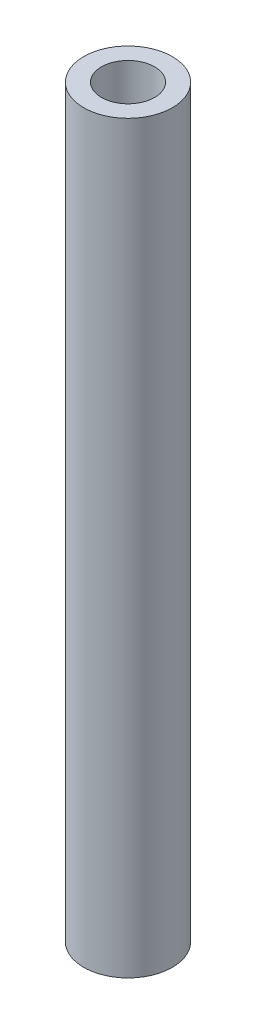
ISO-10303-21;
HEADER;
FILE_DESCRIPTION(('STEP AP214'),'2;1');
FILE_NAME('part.step','',(''),(''),'','','');
FILE_SCHEMA(('AUTOMOTIVE_DESIGN { 1 0 10303 214 1 1 1 1 }'));
ENDSEC;
DATA;
#1=APPLICATION_CONTEXT('core data for automotive mechanical design processes');
#2=APPLICATION_PROTOCOL_DEFINITION('international standard','automotive_design',2000,#1);
#3=PRODUCT_CONTEXT('',#1,'mechanical');
#4=PRODUCT('Part','Part','',(#3));
#5=PRODUCT_RELATED_PRODUCT_CATEGORY('part','',(#4));
#6=PRODUCT_DEFINITION_FORMATION('','',#4);
#7=PRODUCT_DEFINITION_CONTEXT('part definition',#1,'design');
#8=PRODUCT_DEFINITION('design','',#6,#7);
#9=PRODUCT_DEFINITION_SHAPE('','',#8);
#10=(LENGTH_UNIT() NAMED_UNIT(*) SI_UNIT(.MILLI.,.METRE.));
#11=(NAMED_UNIT(*) PLANE_ANGLE_UNIT() SI_UNIT($,.RADIAN.));
#12=(NAMED_UNIT(*) SI_UNIT($,.STERADIAN.) SOLID_ANGLE_UNIT());
#13=UNCERTAINTY_MEASURE_WITH_UNIT(LENGTH_MEASURE(1.E-05),#10,'distance_accuracy_value','');
#14=(GEOMETRIC_REPRESENTATION_CONTEXT(3) GLOBAL_UNCERTAINTY_ASSIGNED_CONTEXT((#13)) GLOBAL_UNIT_ASSIGNED_CONTEXT((#10,
#11,#12)) REPRESENTATION_CONTEXT('',''));
#15=CARTESIAN_POINT('',(0.,0.,0.));
#16=DIRECTION('',(0.,0.,1.));
#17=DIRECTION('',(1.,0.,0.));
#18=AXIS2_PLACEMENT_3D('',#15,#16,#17);
#19=CARTESIAN_POINT('',(0.,42.,0.));
#20=DIRECTION('',(0.,1.,0.));
#21=DIRECTION('',(0.,0.,1.));
#22=AXIS2_PLACEMENT_3D('',#19,#20,#21);
#23=PLANE('',#22);
#24=CARTESIAN_POINT('',(0.,42.,0.));
#25=DIRECTION('',(0.,1.,0.));
#26=DIRECTION('',(0.,0.,1.));
#27=AXIS2_PLACEMENT_3D('',#24,#25,#26);
#28=CIRCLE('',#27,2.5);
#29=CARTESIAN_POINT('',(0.,42.,-2.5));
#30=VERTEX_POINT('',#29);
#31=EDGE_CURVE('E10',#30,#30,#28,.T.);
#32=ORIENTED_EDGE('',*,*,#31,.T.);
#33=EDGE_LOOP('',(#32));
#34=FACE_BOUND('',#33,.T.);
#35=CARTESIAN_POINT('',(0.,42.,0.));
#36=DIRECTION('',(0.,1.,0.));
#37=DIRECTION('',(0.,0.,1.));
#38=AXIS2_PLACEMENT_3D('',#35,#36,#37);
#39=CIRCLE('',#38,1.5);
#40=CARTESIAN_POINT('',(0.,42.,-1.5));
#41=VERTEX_POINT('',#40);
#42=EDGE_CURVE('E49',#41,#41,#39,.T.);
#43=ORIENTED_EDGE('',*,*,#42,.F.);
#44=EDGE_LOOP('',(#43));
#45=FACE_BOUND('',#44,.T.);
#46=ADVANCED_FACE('F38',(#34,#45),#23,.T.);
#47=CARTESIAN_POINT('',(0.,0.,0.));
#48=DIRECTION('',(0.,1.,0.));
#49=DIRECTION('',(0.,0.,1.));
#50=AXIS2_PLACEMENT_3D('',#47,#48,#49);
#51=PLANE('',#50);
#52=CARTESIAN_POINT('',(0.,0.,0.));
#53=DIRECTION('',(0.,1.,0.));
#54=DIRECTION('',(0.,0.,1.));
#55=AXIS2_PLACEMENT_3D('',#52,#53,#54);
#56=CIRCLE('',#55,2.5);
#57=CARTESIAN_POINT('',(0.,0.,-2.5));
#58=VERTEX_POINT('',#57);
#59=EDGE_CURVE('E42',#58,#58,#56,.T.);
#60=ORIENTED_EDGE('',*,*,#59,.F.);
#61=EDGE_LOOP('',(#60));
#62=FACE_BOUND('',#61,.T.);
#63=CARTESIAN_POINT('',(0.,0.,0.));
#64=DIRECTION('',(0.,1.,0.));
#65=DIRECTION('',(0.,0.,1.));
#66=AXIS2_PLACEMENT_3D('',#63,#64,#65);
#67=CIRCLE('',#66,1.5);
#68=CARTESIAN_POINT('',(0.,0.,-1.5));
#69=VERTEX_POINT('',#68);
#70=EDGE_CURVE('E51',#69,#69,#67,.T.);
#71=ORIENTED_EDGE('',*,*,#70,.T.);
#72=EDGE_LOOP('',(#71));
#73=FACE_BOUND('',#72,.T.);
#74=ADVANCED_FACE('F61',(#62,#73),#51,.F.);
#75=CARTESIAN_POINT('',(0.,42.,0.));
#76=DIRECTION('',(0.,-1.,0.));
#77=DIRECTION('',(0.,0.,-1.));
#78=AXIS2_PLACEMENT_3D('',#75,#76,#77);
#79=CYLINDRICAL_SURFACE('',#78,2.5);
#80=CARTESIAN_POINT('',(0.,42.,-2.5));
#81=CARTESIAN_POINT('',(0.,41.5625,-2.5));
#82=CARTESIAN_POINT('',(0.,41.125,-2.5));
#83=CARTESIAN_POINT('',(0.,40.25,-2.5));
#84=CARTESIAN_POINT('',(0.,39.8125,-2.5));
#85=CARTESIAN_POINT('',(0.,38.9375,-2.5));
#86=CARTESIAN_POINT('',(0.,38.5,-2.5));
#87=CARTESIAN_POINT('',(0.,37.625,-2.5));
#88=CARTESIAN_POINT('',(0.,37.1875,-2.5));
#89=CARTESIAN_POINT('',(0.,36.3125,-2.5));
#90=CARTESIAN_POINT('',(0.,35.875,-2.5));
#91=CARTESIAN_POINT('',(0.,35.,-2.5));
#92=CARTESIAN_POINT('',(0.,34.5625,-2.5));
#93=CARTESIAN_POINT('',(0.,33.6875,-2.5));
#94=CARTESIAN_POINT('',(0.,33.25,-2.5));
#95=CARTESIAN_POINT('',(0.,32.375,-2.5));
#96=CARTESIAN_POINT('',(0.,31.9375,-2.5));
#97=CARTESIAN_POINT('',(0.,31.0625,-2.5));
#98=CARTESIAN_POINT('',(0.,30.625,-2.5));
#99=CARTESIAN_POINT('',(0.,29.75,-2.5));
#100=CARTESIAN_POINT('',(0.,29.3125,-2.5));
#101=CARTESIAN_POINT('',(0.,28.4375,-2.5));
#102=CARTESIAN_POINT('',(0.,28.,-2.5));
#103=CARTESIAN_POINT('',(0.,27.125,-2.5));
#104=CARTESIAN_POINT('',(0.,26.6875,-2.5));
#105=CARTESIAN_POINT('',(0.,25.8125,-2.5));
#106=CARTESIAN_POINT('',(0.,25.375,-2.5));
#107=CARTESIAN_POINT('',(0.,24.5,-2.5));
#108=CARTESIAN_POINT('',(0.,24.0625,-2.5));
#109=CARTESIAN_POINT('',(0.,23.1875,-2.5));
#110=CARTESIAN_POINT('',(0.,22.75,-2.5));
#111=CARTESIAN_POINT('',(0.,21.875,-2.5));
#112=CARTESIAN_POINT('',(0.,21.4375,-2.5));
#113=CARTESIAN_POINT('',(0.,20.5625,-2.5));
#114=CARTESIAN_POINT('',(0.,20.125,-2.5));
#115=CARTESIAN_POINT('',(0.,19.25,-2.5));
#116=CARTESIAN_POINT('',(0.,18.8125,-2.5));
#117=CARTESIAN_POINT('',(0.,17.9375,-2.5));
#118=CARTESIAN_POINT('',(0.,17.5,-2.5));
#119=CARTESIAN_POINT('',(0.,16.625,-2.5));
#120=CARTESIAN_POINT('',(0.,16.1875,-2.5));
#121=CARTESIAN_POINT('',(0.,15.3125,-2.5));
#122=CARTESIAN_POINT('',(0.,14.875,-2.5));
#123=CARTESIAN_POINT('',(0.,14.,-2.5));
#124=CARTESIAN_POINT('',(0.,13.5625,-2.5));
#125=CARTESIAN_POINT('',(0.,12.6875,-2.5));
#126=CARTESIAN_POINT('',(0.,12.25,-2.5));
#127=CARTESIAN_POINT('',(0.,11.375,-2.5));
#128=CARTESIAN_POINT('',(0.,10.9375,-2.5));
#129=CARTESIAN_POINT('',(0.,10.0625,-2.5));
#130=CARTESIAN_POINT('',(0.,9.625,-2.5));
#131=CARTESIAN_POINT('',(0.,8.75,-2.5));
#132=CARTESIAN_POINT('',(0.,8.3125,-2.5));
#133=CARTESIAN_POINT('',(0.,7.4375,-2.5));
#134=CARTESIAN_POINT('',(0.,7.,-2.5));
#135=CARTESIAN_POINT('',(0.,6.125,-2.5));
#136=CARTESIAN_POINT('',(0.,5.6875,-2.5));
#137=CARTESIAN_POINT('',(0.,4.8125,-2.5));
#138=CARTESIAN_POINT('',(0.,4.375,-2.5));
#139=CARTESIAN_POINT('',(0.,3.5,-2.5));
#140=CARTESIAN_POINT('',(0.,3.0625,-2.5));
#141=CARTESIAN_POINT('',(0.,2.1875,-2.5));
#142=CARTESIAN_POINT('',(0.,1.75,-2.5));
#143=CARTESIAN_POINT('',(0.,0.875000000000001,-2.5));
#144=CARTESIAN_POINT('',(0.,0.4375,-2.5));
#145=CARTESIAN_POINT('',(0.,0.,-2.5));
#146=B_SPLINE_CURVE_WITH_KNOTS('',3,(#80,#81,#82,#83,#84,#85,#86,#87,#88,#89,#90,#91,#92,#93,
#94,#95,#96,#97,#98,#99,#100,#101,#102,#103,#104,#105,#106,#107,#108,#109,#110,#111,#112,#113,
#114,#115,#116,#117,#118,#119,#120,#121,#122,#123,#124,#125,#126,#127,#128,#129,#130,#131,#132,
#133,#134,#135,#136,#137,#138,#139,#140,#141,#142,#143,#144,#145),.UNSPECIFIED.,.F.,.F.,(4,2,2,
2,2,2,2,2,2,2,2,2,2,2,2,2,2,2,2,2,2,2,2,2,2,2,2,2,2,2,2,2,4),(0.,1.3125,2.625,3.9375,5.25,
6.56250000000001,7.875,9.1875,10.5,11.8125,13.125,14.4375,15.75,17.0625,18.375,19.6875,21.,
22.3125,23.625,24.9375,26.25,27.5625,28.875,30.1875,31.5,32.8125,34.125,35.4375,36.75,38.0625,
39.375,40.6875,42.),.UNSPECIFIED.);
#147=EDGE_CURVE('BSEAM40',#30,#58,#146,.T.);
#148=ORIENTED_EDGE('',*,*,#31,.F.);
#149=ORIENTED_EDGE('',*,*,#59,.T.);
#150=ORIENTED_EDGE('',*,*,#147,.T.);
#151=ORIENTED_EDGE('',*,*,#147,.F.);
#152=EDGE_LOOP('',(#148,#150,#149,#151));
#153=FACE_BOUND('',#152,.T.);
#154=ADVANCED_FACE('F40',(#153),#79,.T.);
#155=CARTESIAN_POINT('',(0.,42.,0.));
#156=DIRECTION('',(0.,-1.,0.));
#157=DIRECTION('',(0.,0.,-1.));
#158=AXIS2_PLACEMENT_3D('',#155,#156,#157);
#159=CYLINDRICAL_SURFACE('',#158,1.5);
#160=CARTESIAN_POINT('',(0.,42.,-1.5));
#161=CARTESIAN_POINT('',(0.,41.5625,-1.5));
#162=CARTESIAN_POINT('',(0.,41.125,-1.5));
#163=CARTESIAN_POINT('',(0.,40.25,-1.5));
#164=CARTESIAN_POINT('',(0.,39.8125,-1.5));
#165=CARTESIAN_POINT('',(0.,38.9375,-1.5));
#166=CARTESIAN_POINT('',(0.,38.5,-1.5));
#167=CARTESIAN_POINT('',(0.,37.625,-1.5));
#168=CARTESIAN_POINT('',(0.,37.1875,-1.5));
#169=CARTESIAN_POINT('',(0.,36.3125,-1.5));
#170=CARTESIAN_POINT('',(0.,35.875,-1.5));
#171=CARTESIAN_POINT('',(0.,35.,-1.5));
#172=CARTESIAN_POINT('',(0.,34.5625,-1.5));
#173=CARTESIAN_POINT('',(0.,33.6875,-1.5));
#174=CARTESIAN_POINT('',(0.,33.25,-1.5));
#175=CARTESIAN_POINT('',(0.,32.375,-1.5));
#176=CARTESIAN_POINT('',(0.,31.9375,-1.5));
#177=CARTESIAN_POINT('',(0.,31.0625,-1.5));
#178=CARTESIAN_POINT('',(0.,30.625,-1.5));
#179=CARTESIAN_POINT('',(0.,29.75,-1.5));
#180=CARTESIAN_POINT('',(0.,29.3125,-1.5));
#181=CARTESIAN_POINT('',(0.,28.4375,-1.5));
#182=CARTESIAN_POINT('',(0.,28.,-1.5));
#183=CARTESIAN_POINT('',(0.,27.125,-1.5));
#184=CARTESIAN_POINT('',(0.,26.6875,-1.5));
#185=CARTESIAN_POINT('',(0.,25.8125,-1.5));
#186=CARTESIAN_POINT('',(0.,25.375,-1.5));
#187=CARTESIAN_POINT('',(0.,24.5,-1.5));
#188=CARTESIAN_POINT('',(0.,24.0625,-1.5));
#189=CARTESIAN_POINT('',(0.,23.1875,-1.5));
#190=CARTESIAN_POINT('',(0.,22.75,-1.5));
#191=CARTESIAN_POINT('',(0.,21.875,-1.5));
#192=CARTESIAN_POINT('',(0.,21.4375,-1.5));
#193=CARTESIAN_POINT('',(0.,20.5625,-1.5));
#194=CARTESIAN_POINT('',(0.,20.125,-1.5));
#195=CARTESIAN_POINT('',(0.,19.25,-1.5));
#196=CARTESIAN_POINT('',(0.,18.8125,-1.5));
#197=CARTESIAN_POINT('',(0.,17.9375,-1.5));
#198=CARTESIAN_POINT('',(0.,17.5,-1.5));
#199=CARTESIAN_POINT('',(0.,16.625,-1.5));
#200=CARTESIAN_POINT('',(0.,16.1875,-1.5));
#201=CARTESIAN_POINT('',(0.,15.3125,-1.5));
#202=CARTESIAN_POINT('',(0.,14.875,-1.5));
#203=CARTESIAN_POINT('',(0.,14.,-1.5));
#204=CARTESIAN_POINT('',(0.,13.5625,-1.5));
#205=CARTESIAN_POINT('',(0.,12.6875,-1.5));
#206=CARTESIAN_POINT('',(0.,12.25,-1.5));
#207=CARTESIAN_POINT('',(0.,11.375,-1.5));
#208=CARTESIAN_POINT('',(0.,10.9375,-1.5));
#209=CARTESIAN_POINT('',(0.,10.0625,-1.5));
#210=CARTESIAN_POINT('',(0.,9.625,-1.5));
#211=CARTESIAN_POINT('',(0.,8.75,-1.5));
#212=CARTESIAN_POINT('',(0.,8.3125,-1.5));
#213=CARTESIAN_POINT('',(0.,7.4375,-1.5));
#214=CARTESIAN_POINT('',(0.,7.,-1.5));
#215=CARTESIAN_POINT('',(0.,6.125,-1.5));
#216=CARTESIAN_POINT('',(0.,5.6875,-1.5));
#217=CARTESIAN_POINT('',(0.,4.8125,-1.5));
#218=CARTESIAN_POINT('',(0.,4.375,-1.5));
#219=CARTESIAN_POINT('',(0.,3.5,-1.5));
#220=CARTESIAN_POINT('',(0.,3.0625,-1.5));
#221=CARTESIAN_POINT('',(0.,2.1875,-1.5));
#222=CARTESIAN_POINT('',(0.,1.75,-1.5));
#223=CARTESIAN_POINT('',(0.,0.875000000000001,-1.5));
#224=CARTESIAN_POINT('',(0.,0.4375,-1.5));
#225=CARTESIAN_POINT('',(0.,0.,-1.5));
#226=B_SPLINE_CURVE_WITH_KNOTS('',3,(#160,#161,#162,#163,#164,#165,#166,#167,#168,#169,#170,
#171,#172,#173,#174,#175,#176,#177,#178,#179,#180,#181,#182,#183,#184,#185,#186,#187,#188,#189,
#190,#191,#192,#193,#194,#195,#196,#197,#198,#199,#200,#201,#202,#203,#204,#205,#206,#207,#208,
#209,#210,#211,#212,#213,#214,#215,#216,#217,#218,#219,#220,#221,#222,#223,#224,#225),
.UNSPECIFIED.,.F.,.F.,(4,2,2,2,2,2,2,2,2,2,2,2,2,2,2,2,2,2,2,2,2,2,2,2,2,2,2,2,2,2,2,2,4),(0.,
1.31249999999999,2.625,3.9375,5.25,6.5625,7.87499999999999,9.18749999999999,10.5,11.8125,13.125,
14.4375,15.75,17.0625,18.375,19.6875,21.,22.3125,23.625,24.9375,26.25,27.5625,28.875,30.1875,
31.5,32.8125,34.125,35.4375,36.75,38.0625,39.375,40.6875,42.),.UNSPECIFIED.);
#227=EDGE_CURVE('BSEAM57',#41,#69,#226,.T.);
#228=ORIENTED_EDGE('',*,*,#42,.T.);
#229=ORIENTED_EDGE('',*,*,#70,.F.);
#230=ORIENTED_EDGE('',*,*,#227,.T.);
#231=ORIENTED_EDGE('',*,*,#227,.F.);
#232=EDGE_LOOP('',(#228,#230,#229,#231));
#233=FACE_BOUND('',#232,.T.);
#234=ADVANCED_FACE('F57',(#233),#159,.F.);
#235=CLOSED_SHELL('',(#46,#74,#154,#234));
#236=MANIFOLD_SOLID_BREP('B2',#235);
#237=ADVANCED_BREP_SHAPE_REPRESENTATION('',(#18,#236),#14);
#238=SHAPE_DEFINITION_REPRESENTATION(#9,#237);
ENDSEC;
END-ISO-10303-21;
